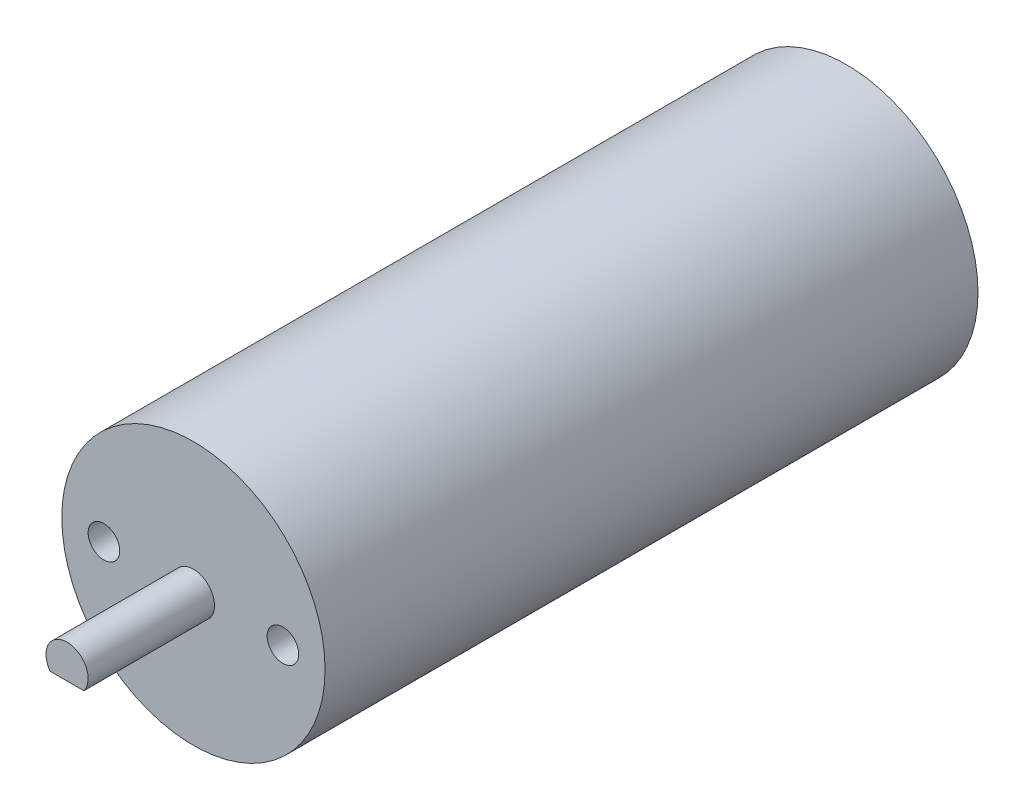
ISO-10303-21;
HEADER;
FILE_DESCRIPTION(('STEP AP214'),'2;1');
FILE_NAME('part.step','',(''),(''),'','','');
FILE_SCHEMA(('AUTOMOTIVE_DESIGN { 1 0 10303 214 1 1 1 1 }'));
ENDSEC;
DATA;
#1=APPLICATION_CONTEXT('core data for automotive mechanical design processes');
#2=APPLICATION_PROTOCOL_DEFINITION('international standard','automotive_design',2000,#1);
#3=PRODUCT_CONTEXT('',#1,'mechanical');
#4=PRODUCT('Part','Part','',(#3));
#5=PRODUCT_RELATED_PRODUCT_CATEGORY('part','',(#4));
#6=PRODUCT_DEFINITION_FORMATION('','',#4);
#7=PRODUCT_DEFINITION_CONTEXT('part definition',#1,'design');
#8=PRODUCT_DEFINITION('design','',#6,#7);
#9=PRODUCT_DEFINITION_SHAPE('','',#8);
#10=(LENGTH_UNIT() NAMED_UNIT(*) SI_UNIT(.MILLI.,.METRE.));
#11=(NAMED_UNIT(*) PLANE_ANGLE_UNIT() SI_UNIT($,.RADIAN.));
#12=(NAMED_UNIT(*) SI_UNIT($,.STERADIAN.) SOLID_ANGLE_UNIT());
#13=UNCERTAINTY_MEASURE_WITH_UNIT(LENGTH_MEASURE(1.E-05),#10,'distance_accuracy_value','');
#14=(GEOMETRIC_REPRESENTATION_CONTEXT(3) GLOBAL_UNCERTAINTY_ASSIGNED_CONTEXT((#13)) GLOBAL_UNIT_ASSIGNED_CONTEXT((#10,
#11,#12)) REPRESENTATION_CONTEXT('',''));
#15=CARTESIAN_POINT('',(0.,0.,0.));
#16=DIRECTION('',(0.,0.,1.));
#17=DIRECTION('',(1.,0.,0.));
#18=AXIS2_PLACEMENT_3D('',#15,#16,#17);
#19=CARTESIAN_POINT('',(0.,0.,62.));
#20=DIRECTION('',(0.,0.,-1.));
#21=DIRECTION('',(-1.,0.,0.));
#22=AXIS2_PLACEMENT_3D('',#19,#20,#21);
#23=CYLINDRICAL_SURFACE('',#22,12.5);
#24=CARTESIAN_POINT('',(0.,0.,62.));
#25=DIRECTION('',(0.,0.,1.));
#26=DIRECTION('',(1.,0.,0.));
#27=AXIS2_PLACEMENT_3D('',#24,#25,#26);
#28=CIRCLE('',#27,12.5);
#29=CARTESIAN_POINT('',(12.5,0.,62.));
#30=VERTEX_POINT('',#29);
#31=EDGE_CURVE('E11',#30,#30,#28,.T.);
#32=ORIENTED_EDGE('',*,*,#31,.F.);
#33=EDGE_LOOP('',(#32));
#34=FACE_BOUND('',#33,.T.);
#35=CARTESIAN_POINT('',(0.,0.,0.));
#36=DIRECTION('',(0.,0.,1.));
#37=DIRECTION('',(1.,0.,0.));
#38=AXIS2_PLACEMENT_3D('',#35,#36,#37);
#39=CIRCLE('',#38,12.5);
#40=CARTESIAN_POINT('',(12.5,0.,0.));
#41=VERTEX_POINT('',#40);
#42=EDGE_CURVE('E41',#41,#41,#39,.T.);
#43=ORIENTED_EDGE('',*,*,#42,.T.);
#44=EDGE_LOOP('',(#43));
#45=FACE_BOUND('',#44,.T.);
#46=ADVANCED_FACE('F38',(#34,#45),#23,.T.);
#47=CARTESIAN_POINT('',(0.,0.,62.));
#48=DIRECTION('',(0.,0.,1.));
#49=DIRECTION('',(1.,0.,0.));
#50=AXIS2_PLACEMENT_3D('',#47,#48,#49);
#51=PLANE('',#50);
#52=CARTESIAN_POINT('',(-8.5,0.,62.));
#53=DIRECTION('',(0.,0.,1.));
#54=DIRECTION('',(1.,0.,0.));
#55=AXIS2_PLACEMENT_3D('',#52,#53,#54);
#56=CIRCLE('',#55,1.5);
#57=CARTESIAN_POINT('',(-7.,0.,62.));
#58=VERTEX_POINT('',#57);
#59=EDGE_CURVE('E100',#58,#58,#56,.T.);
#60=ORIENTED_EDGE('',*,*,#59,.F.);
#61=EDGE_LOOP('',(#60));
#62=FACE_BOUND('',#61,.T.);
#63=CARTESIAN_POINT('',(8.5,0.,62.));
#64=DIRECTION('',(0.,0.,1.));
#65=DIRECTION('',(-1.,0.,0.));
#66=AXIS2_PLACEMENT_3D('',#63,#64,#65);
#67=CIRCLE('',#66,1.5);
#68=CARTESIAN_POINT('',(7.,0.,62.));
#69=VERTEX_POINT('',#68);
#70=EDGE_CURVE('E92',#69,#69,#67,.T.);
#71=ORIENTED_EDGE('',*,*,#70,.F.);
#72=EDGE_LOOP('',(#71));
#73=FACE_BOUND('',#72,.T.);
#74=CARTESIAN_POINT('',(0.,0.,62.));
#75=DIRECTION('',(0.,0.,1.));
#76=DIRECTION('',(1.,0.,0.));
#77=AXIS2_PLACEMENT_3D('',#74,#75,#76);
#78=CIRCLE('',#77,2.);
#79=CARTESIAN_POINT('',(1.6,-1.2,62.));
#80=VERTEX_POINT('',#79);
#81=CARTESIAN_POINT('',(-1.6,-1.2,62.));
#82=VERTEX_POINT('',#81);
#83=EDGE_CURVE('E65',#80,#82,#78,.T.);
#84=ORIENTED_EDGE('',*,*,#83,.F.);
#85=DIRECTION('',(1.,0.,0.));
#86=VECTOR('',#85,1.);
#87=CARTESIAN_POINT('',(-1.6,-1.2,62.));
#88=LINE('',#87,#86);
#89=EDGE_CURVE('E52',#82,#80,#88,.T.);
#90=ORIENTED_EDGE('',*,*,#89,.F.);
#91=EDGE_LOOP('',(#84,#90));
#92=FACE_BOUND('',#91,.T.);
#93=ORIENTED_EDGE('',*,*,#31,.T.);
#94=EDGE_LOOP('',(#93));
#95=FACE_BOUND('',#94,.T.);
#96=ADVANCED_FACE('F66',(#62,#73,#92,#95),#51,.T.);
#97=CARTESIAN_POINT('',(0.,0.,0.));
#98=DIRECTION('',(0.,0.,1.));
#99=DIRECTION('',(1.,0.,0.));
#100=AXIS2_PLACEMENT_3D('',#97,#98,#99);
#101=PLANE('',#100);
#102=ORIENTED_EDGE('',*,*,#42,.F.);
#103=EDGE_LOOP('',(#102));
#104=FACE_BOUND('',#103,.T.);
#105=ADVANCED_FACE('F119',(#104),#101,.F.);
#106=CARTESIAN_POINT('',(0.,0.,74.));
#107=DIRECTION('',(0.,0.,-1.));
#108=DIRECTION('',(-1.,0.,0.));
#109=AXIS2_PLACEMENT_3D('',#106,#107,#108);
#110=CYLINDRICAL_SURFACE('',#109,2.);
#111=ORIENTED_EDGE('',*,*,#83,.T.);
#112=DIRECTION('',(0.,0.,-1.));
#113=VECTOR('',#112,1.);
#114=CARTESIAN_POINT('',(-1.6,-1.2,74.));
#115=LINE('',#114,#113);
#116=CARTESIAN_POINT('',(-1.6,-1.2,74.));
#117=VERTEX_POINT('',#116);
#118=EDGE_CURVE('E78',#117,#82,#115,.T.);
#119=ORIENTED_EDGE('',*,*,#118,.F.);
#120=CARTESIAN_POINT('',(0.,0.,74.));
#121=DIRECTION('',(0.,0.,1.));
#122=DIRECTION('',(1.,0.,0.));
#123=AXIS2_PLACEMENT_3D('',#120,#121,#122);
#124=CIRCLE('',#123,2.);
#125=CARTESIAN_POINT('',(1.6,-1.2,74.));
#126=VERTEX_POINT('',#125);
#127=EDGE_CURVE('E80',#126,#117,#124,.T.);
#128=ORIENTED_EDGE('',*,*,#127,.F.);
#129=DIRECTION('',(0.,0.,-1.));
#130=VECTOR('',#129,1.);
#131=CARTESIAN_POINT('',(1.6,-1.2,74.));
#132=LINE('',#131,#130);
#133=EDGE_CURVE('E76',#126,#80,#132,.T.);
#134=ORIENTED_EDGE('',*,*,#133,.T.);
#135=EDGE_LOOP('',(#111,#119,#128,#134));
#136=FACE_BOUND('',#135,.T.);
#137=ADVANCED_FACE('F82',(#136),#110,.T.);
#138=CARTESIAN_POINT('',(-1.6,-1.2,74.));
#139=DIRECTION('',(0.,1.,0.));
#140=DIRECTION('',(0.,0.,1.));
#141=AXIS2_PLACEMENT_3D('',#138,#139,#140);
#142=PLANE('',#141);
#143=ORIENTED_EDGE('',*,*,#89,.T.);
#144=ORIENTED_EDGE('',*,*,#133,.F.);
#145=DIRECTION('',(1.,0.,0.));
#146=VECTOR('',#145,1.);
#147=CARTESIAN_POINT('',(-1.6,-1.2,74.));
#148=LINE('',#147,#146);
#149=EDGE_CURVE('E60',#117,#126,#148,.T.);
#150=ORIENTED_EDGE('',*,*,#149,.F.);
#151=ORIENTED_EDGE('',*,*,#118,.T.);
#152=EDGE_LOOP('',(#143,#144,#150,#151));
#153=FACE_BOUND('',#152,.T.);
#154=ADVANCED_FACE('F75',(#153),#142,.F.);
#155=CARTESIAN_POINT('',(0.,0.,74.));
#156=DIRECTION('',(0.,0.,1.));
#157=DIRECTION('',(1.,0.,0.));
#158=AXIS2_PLACEMENT_3D('',#155,#156,#157);
#159=PLANE('',#158);
#160=ORIENTED_EDGE('',*,*,#127,.T.);
#161=ORIENTED_EDGE('',*,*,#149,.T.);
#162=EDGE_LOOP('',(#160,#161));
#163=FACE_BOUND('',#162,.T.);
#164=ADVANCED_FACE('F125',(#163),#159,.T.);
#165=CARTESIAN_POINT('',(8.5,0.,58.));
#166=DIRECTION('',(0.,0.,1.));
#167=DIRECTION('',(1.,0.,0.));
#168=AXIS2_PLACEMENT_3D('',#165,#166,#167);
#169=CYLINDRICAL_SURFACE('',#168,1.5);
#170=CARTESIAN_POINT('',(8.5,0.,58.));
#171=DIRECTION('',(0.,0.,1.));
#172=DIRECTION('',(-1.,0.,0.));
#173=AXIS2_PLACEMENT_3D('',#170,#171,#172);
#174=CIRCLE('',#173,1.5);
#175=CARTESIAN_POINT('',(7.,0.,58.));
#176=VERTEX_POINT('',#175);
#177=EDGE_CURVE('E96',#176,#176,#174,.T.);
#178=ORIENTED_EDGE('',*,*,#177,.F.);
#179=EDGE_LOOP('',(#178));
#180=FACE_BOUND('',#179,.T.);
#181=ORIENTED_EDGE('',*,*,#70,.T.);
#182=EDGE_LOOP('',(#181));
#183=FACE_BOUND('',#182,.T.);
#184=ADVANCED_FACE('F123',(#180,#183),#169,.F.);
#185=CARTESIAN_POINT('',(8.5,0.,58.));
#186=DIRECTION('',(0.,0.,-1.));
#187=DIRECTION('',(-1.,0.,0.));
#188=AXIS2_PLACEMENT_3D('',#185,#186,#187);
#189=PLANE('',#188);
#190=ORIENTED_EDGE('',*,*,#177,.T.);
#191=EDGE_LOOP('',(#190));
#192=FACE_BOUND('',#191,.T.);
#193=ADVANCED_FACE('F113',(#192),#189,.F.);
#194=CARTESIAN_POINT('',(-8.5,0.,58.));
#195=DIRECTION('',(0.,0.,1.));
#196=DIRECTION('',(1.,0.,0.));
#197=AXIS2_PLACEMENT_3D('',#194,#195,#196);
#198=CYLINDRICAL_SURFACE('',#197,1.5);
#199=CARTESIAN_POINT('',(-8.5,0.,58.));
#200=DIRECTION('',(0.,0.,1.));
#201=DIRECTION('',(1.,0.,0.));
#202=AXIS2_PLACEMENT_3D('',#199,#200,#201);
#203=CIRCLE('',#202,1.5);
#204=CARTESIAN_POINT('',(-7.,0.,58.));
#205=VERTEX_POINT('',#204);
#206=EDGE_CURVE('E72',#205,#205,#203,.T.);
#207=ORIENTED_EDGE('',*,*,#206,.F.);
#208=EDGE_LOOP('',(#207));
#209=FACE_BOUND('',#208,.T.);
#210=ORIENTED_EDGE('',*,*,#59,.T.);
#211=EDGE_LOOP('',(#210));
#212=FACE_BOUND('',#211,.T.);
#213=ADVANCED_FACE('F110',(#209,#212),#198,.F.);
#214=CARTESIAN_POINT('',(-8.5,0.,58.));
#215=DIRECTION('',(0.,0.,1.));
#216=DIRECTION('',(1.,0.,0.));
#217=AXIS2_PLACEMENT_3D('',#214,#215,#216);
#218=PLANE('',#217);
#219=ORIENTED_EDGE('',*,*,#206,.T.);
#220=EDGE_LOOP('',(#219));
#221=FACE_BOUND('',#220,.T.);
#222=ADVANCED_FACE('F108',(#221),#218,.T.);
#223=CLOSED_SHELL('',(#46,#96,#105,#137,#154,#164,#184,#193,#213,#222));
#224=MANIFOLD_SOLID_BREP('B2',#223);
#225=ADVANCED_BREP_SHAPE_REPRESENTATION('',(#18,#224),#14);
#226=SHAPE_DEFINITION_REPRESENTATION(#9,#225);
ENDSEC;
END-ISO-10303-21;
